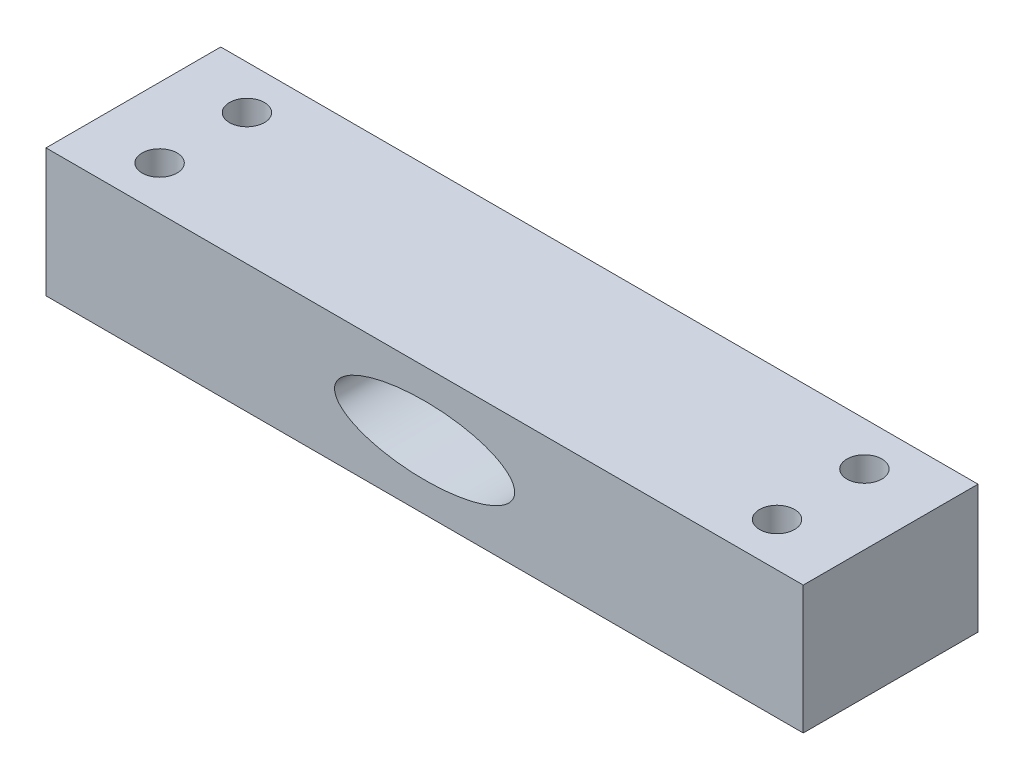
ISO-10303-21;
HEADER;
FILE_DESCRIPTION(('STEP AP214'),'2;1');
FILE_NAME('part.step','',(''),(''),'','','');
FILE_SCHEMA(('AUTOMOTIVE_DESIGN { 1 0 10303 214 1 1 1 1 }'));
ENDSEC;
DATA;
#1=APPLICATION_CONTEXT('core data for automotive mechanical design processes');
#2=APPLICATION_PROTOCOL_DEFINITION('international standard','automotive_design',2000,#1);
#3=PRODUCT_CONTEXT('',#1,'mechanical');
#4=PRODUCT('Part','Part','',(#3));
#5=PRODUCT_RELATED_PRODUCT_CATEGORY('part','',(#4));
#6=PRODUCT_DEFINITION_FORMATION('','',#4);
#7=PRODUCT_DEFINITION_CONTEXT('part definition',#1,'design');
#8=PRODUCT_DEFINITION('design','',#6,#7);
#9=PRODUCT_DEFINITION_SHAPE('','',#8);
#10=(LENGTH_UNIT() NAMED_UNIT(*) SI_UNIT(.MILLI.,.METRE.));
#11=(NAMED_UNIT(*) PLANE_ANGLE_UNIT() SI_UNIT($,.RADIAN.));
#12=(NAMED_UNIT(*) SI_UNIT($,.STERADIAN.) SOLID_ANGLE_UNIT());
#13=UNCERTAINTY_MEASURE_WITH_UNIT(LENGTH_MEASURE(1.E-05),#10,'distance_accuracy_value','');
#14=(GEOMETRIC_REPRESENTATION_CONTEXT(3) GLOBAL_UNCERTAINTY_ASSIGNED_CONTEXT((#13)) GLOBAL_UNIT_ASSIGNED_CONTEXT((#10,
#11,#12)) REPRESENTATION_CONTEXT('',''));
#15=CARTESIAN_POINT('',(0.,0.,0.));
#16=DIRECTION('',(0.,0.,1.));
#17=DIRECTION('',(1.,0.,0.));
#18=AXIS2_PLACEMENT_3D('',#15,#16,#17);
#19=CARTESIAN_POINT('',(65.,22.,15.));
#20=DIRECTION('',(-1.,0.,0.));
#21=DIRECTION('',(0.,0.,1.));
#22=AXIS2_PLACEMENT_3D('',#19,#20,#21);
#23=PLANE('',#22);
#24=DIRECTION('',(0.,0.,-1.));
#25=VECTOR('',#24,1.);
#26=CARTESIAN_POINT('',(65.,0.,15.));
#27=LINE('',#26,#25);
#28=CARTESIAN_POINT('',(65.,0.,15.));
#29=VERTEX_POINT('',#28);
#30=CARTESIAN_POINT('',(65.,0.,-15.));
#31=VERTEX_POINT('',#30);
#32=EDGE_CURVE('E178',#29,#31,#27,.T.);
#33=ORIENTED_EDGE('',*,*,#32,.T.);
#34=DIRECTION('',(0.,-1.,0.));
#35=VECTOR('',#34,1.);
#36=CARTESIAN_POINT('',(65.,22.,-15.));
#37=LINE('',#36,#35);
#38=CARTESIAN_POINT('',(65.,22.,-15.));
#39=VERTEX_POINT('',#38);
#40=EDGE_CURVE('E11',#39,#31,#37,.T.);
#41=ORIENTED_EDGE('',*,*,#40,.F.);
#42=DIRECTION('',(0.,0.,-1.));
#43=VECTOR('',#42,1.);
#44=CARTESIAN_POINT('',(65.,22.,15.));
#45=LINE('',#44,#43);
#46=CARTESIAN_POINT('',(65.,22.,15.));
#47=VERTEX_POINT('',#46);
#48=EDGE_CURVE('E226',#47,#39,#45,.T.);
#49=ORIENTED_EDGE('',*,*,#48,.F.);
#50=DIRECTION('',(0.,-1.,0.));
#51=VECTOR('',#50,1.);
#52=CARTESIAN_POINT('',(65.,22.,15.));
#53=LINE('',#52,#51);
#54=EDGE_CURVE('E230',#47,#29,#53,.T.);
#55=ORIENTED_EDGE('',*,*,#54,.T.);
#56=EDGE_LOOP('',(#33,#41,#49,#55));
#57=FACE_BOUND('',#56,.T.);
#58=ADVANCED_FACE('F38',(#57),#23,.F.);
#59=CARTESIAN_POINT('',(-65.,22.,-15.));
#60=DIRECTION('',(0.,0.,1.));
#61=DIRECTION('',(1.,0.,0.));
#62=AXIS2_PLACEMENT_3D('',#59,#60,#61);
#63=PLANE('',#62);
#64=CARTESIAN_POINT('',(0.,11.,-15.));
#65=DIRECTION('',(0.,0.,1.));
#66=DIRECTION('',(1.,0.,0.));
#67=AXIS2_PLACEMENT_3D('',#64,#65,#66);
#68=ELLIPSE('',#67,15.4617469757657,5.88469474450801);
#69=CARTESIAN_POINT('',(15.4617469757657,11.,-15.));
#70=VERTEX_POINT('',#69);
#71=EDGE_CURVE('E174',#70,#70,#68,.T.);
#72=ORIENTED_EDGE('',*,*,#71,.T.);
#73=EDGE_LOOP('',(#72));
#74=FACE_BOUND('',#73,.T.);
#75=DIRECTION('',(-1.,0.,0.));
#76=VECTOR('',#75,1.);
#77=CARTESIAN_POINT('',(-65.,0.,-15.));
#78=LINE('',#77,#76);
#79=CARTESIAN_POINT('',(-65.,0.,-15.));
#80=VERTEX_POINT('',#79);
#81=EDGE_CURVE('E211',#31,#80,#78,.T.);
#82=ORIENTED_EDGE('',*,*,#81,.T.);
#83=DIRECTION('',(0.,-1.,0.));
#84=VECTOR('',#83,1.);
#85=CARTESIAN_POINT('',(-65.,22.,-15.));
#86=LINE('',#85,#84);
#87=CARTESIAN_POINT('',(-65.,22.,-15.));
#88=VERTEX_POINT('',#87);
#89=EDGE_CURVE('E45',#88,#80,#86,.T.);
#90=ORIENTED_EDGE('',*,*,#89,.F.);
#91=DIRECTION('',(-1.,0.,0.));
#92=VECTOR('',#91,1.);
#93=CARTESIAN_POINT('',(-65.,22.,-15.));
#94=LINE('',#93,#92);
#95=EDGE_CURVE('E89',#39,#88,#94,.T.);
#96=ORIENTED_EDGE('',*,*,#95,.F.);
#97=ORIENTED_EDGE('',*,*,#40,.T.);
#98=EDGE_LOOP('',(#82,#90,#96,#97));
#99=FACE_BOUND('',#98,.T.);
#100=ADVANCED_FACE('F202',(#74,#99),#63,.F.);
#101=CARTESIAN_POINT('',(-65.,22.,15.));
#102=DIRECTION('',(1.,0.,0.));
#103=DIRECTION('',(0.,0.,-1.));
#104=AXIS2_PLACEMENT_3D('',#101,#102,#103);
#105=PLANE('',#104);
#106=DIRECTION('',(0.,0.,-1.));
#107=VECTOR('',#106,1.);
#108=CARTESIAN_POINT('',(-65.,17.3244994375708,-0.692463442069746));
#109=LINE('',#108,#107);
#110=CARTESIAN_POINT('',(-65.,17.3244994375708,0.692463442069746));
#111=VERTEX_POINT('',#110);
#112=CARTESIAN_POINT('',(-65.,17.3244994375708,-0.692463442069746));
#113=VERTEX_POINT('',#112);
#114=EDGE_CURVE('E140',#111,#113,#109,.T.);
#115=ORIENTED_EDGE('',*,*,#114,.F.);
#116=DIRECTION('',(0.,1.,0.));
#117=VECTOR('',#116,1.);
#118=CARTESIAN_POINT('',(-65.,2.12107986501732,0.692463442069746));
#119=LINE('',#118,#117);
#120=CARTESIAN_POINT('',(-65.,2.12107986501732,0.692463442069746));
#121=VERTEX_POINT('',#120);
#122=EDGE_CURVE('E52',#121,#111,#119,.T.);
#123=ORIENTED_EDGE('',*,*,#122,.F.);
#124=DIRECTION('',(0.,0.,1.));
#125=VECTOR('',#124,1.);
#126=CARTESIAN_POINT('',(-65.,2.12107986501732,-0.692463442069746));
#127=LINE('',#126,#125);
#128=CARTESIAN_POINT('',(-65.,2.12107986501732,-0.692463442069746));
#129=VERTEX_POINT('',#128);
#130=EDGE_CURVE('E131',#129,#121,#127,.T.);
#131=ORIENTED_EDGE('',*,*,#130,.F.);
#132=DIRECTION('',(0.,-1.,0.));
#133=VECTOR('',#132,1.);
#134=CARTESIAN_POINT('',(-65.,2.12107986501732,-0.692463442069746));
#135=LINE('',#134,#133);
#136=EDGE_CURVE('E134',#113,#129,#135,.T.);
#137=ORIENTED_EDGE('',*,*,#136,.F.);
#138=EDGE_LOOP('',(#115,#123,#131,#137));
#139=FACE_BOUND('',#138,.T.);
#140=DIRECTION('',(0.,0.,1.));
#141=VECTOR('',#140,1.);
#142=CARTESIAN_POINT('',(-65.,0.,15.));
#143=LINE('',#142,#141);
#144=CARTESIAN_POINT('',(-65.,0.,15.));
#145=VERTEX_POINT('',#144);
#146=EDGE_CURVE('E219',#80,#145,#143,.T.);
#147=ORIENTED_EDGE('',*,*,#146,.T.);
#148=DIRECTION('',(0.,-1.,0.));
#149=VECTOR('',#148,1.);
#150=CARTESIAN_POINT('',(-65.,22.,15.));
#151=LINE('',#150,#149);
#152=CARTESIAN_POINT('',(-65.,22.,15.));
#153=VERTEX_POINT('',#152);
#154=EDGE_CURVE('E224',#153,#145,#151,.T.);
#155=ORIENTED_EDGE('',*,*,#154,.F.);
#156=DIRECTION('',(0.,0.,1.));
#157=VECTOR('',#156,1.);
#158=CARTESIAN_POINT('',(-65.,22.,15.));
#159=LINE('',#158,#157);
#160=EDGE_CURVE('E223',#88,#153,#159,.T.);
#161=ORIENTED_EDGE('',*,*,#160,.F.);
#162=ORIENTED_EDGE('',*,*,#89,.T.);
#163=EDGE_LOOP('',(#147,#155,#161,#162));
#164=FACE_BOUND('',#163,.T.);
#165=ADVANCED_FACE('F199',(#139,#164),#105,.F.);
#166=CARTESIAN_POINT('',(-65.,22.,15.));
#167=DIRECTION('',(0.,0.,-1.));
#168=DIRECTION('',(-1.,0.,0.));
#169=AXIS2_PLACEMENT_3D('',#166,#167,#168);
#170=PLANE('',#169);
#171=CARTESIAN_POINT('',(0.,11.,15.));
#172=DIRECTION('',(0.,0.,1.));
#173=DIRECTION('',(1.,0.,0.));
#174=AXIS2_PLACEMENT_3D('',#171,#172,#173);
#175=ELLIPSE('',#174,15.4617469757657,5.88469474450801);
#176=CARTESIAN_POINT('',(15.4617469757657,11.,15.));
#177=VERTEX_POINT('',#176);
#178=EDGE_CURVE('E171',#177,#177,#175,.T.);
#179=ORIENTED_EDGE('',*,*,#178,.F.);
#180=EDGE_LOOP('',(#179));
#181=FACE_BOUND('',#180,.T.);
#182=DIRECTION('',(1.,0.,0.));
#183=VECTOR('',#182,1.);
#184=CARTESIAN_POINT('',(-65.,0.,15.));
#185=LINE('',#184,#183);
#186=EDGE_CURVE('E82',#145,#29,#185,.T.);
#187=ORIENTED_EDGE('',*,*,#186,.T.);
#188=ORIENTED_EDGE('',*,*,#54,.F.);
#189=DIRECTION('',(1.,0.,0.));
#190=VECTOR('',#189,1.);
#191=CARTESIAN_POINT('',(-65.,22.,15.));
#192=LINE('',#191,#190);
#193=EDGE_CURVE('E61',#153,#47,#192,.T.);
#194=ORIENTED_EDGE('',*,*,#193,.F.);
#195=ORIENTED_EDGE('',*,*,#154,.T.);
#196=EDGE_LOOP('',(#187,#188,#194,#195));
#197=FACE_BOUND('',#196,.T.);
#198=ADVANCED_FACE('F192',(#181,#197),#170,.F.);
#199=CARTESIAN_POINT('',(0.,22.,0.));
#200=DIRECTION('',(0.,-1.,0.));
#201=DIRECTION('',(0.,0.,-1.));
#202=AXIS2_PLACEMENT_3D('',#199,#200,#201);
#203=PLANE('',#202);
#204=CARTESIAN_POINT('',(-53.,22.,7.5));
#205=DIRECTION('',(0.,1.,0.));
#206=DIRECTION('',(0.,0.,-1.));
#207=AXIS2_PLACEMENT_3D('',#204,#205,#206);
#208=CIRCLE('',#207,3.);
#209=CARTESIAN_POINT('',(-53.,22.,4.5));
#210=VERTEX_POINT('',#209);
#211=EDGE_CURVE('E163',#210,#210,#208,.T.);
#212=ORIENTED_EDGE('',*,*,#211,.F.);
#213=EDGE_LOOP('',(#212));
#214=FACE_BOUND('',#213,.T.);
#215=CARTESIAN_POINT('',(53.,22.,7.50000000000044));
#216=DIRECTION('',(0.,1.,0.));
#217=DIRECTION('',(0.,0.,1.));
#218=AXIS2_PLACEMENT_3D('',#215,#216,#217);
#219=CIRCLE('',#218,3.);
#220=CARTESIAN_POINT('',(53.,22.,10.5000000000004));
#221=VERTEX_POINT('',#220);
#222=EDGE_CURVE('E157',#221,#221,#219,.T.);
#223=ORIENTED_EDGE('',*,*,#222,.F.);
#224=EDGE_LOOP('',(#223));
#225=FACE_BOUND('',#224,.T.);
#226=CARTESIAN_POINT('',(53.,22.,-7.50000000000044));
#227=DIRECTION('',(0.,1.,0.));
#228=DIRECTION('',(0.,0.,-1.));
#229=AXIS2_PLACEMENT_3D('',#226,#227,#228);
#230=CIRCLE('',#229,3.);
#231=CARTESIAN_POINT('',(53.,22.,-10.5000000000004));
#232=VERTEX_POINT('',#231);
#233=EDGE_CURVE('E150',#232,#232,#230,.T.);
#234=ORIENTED_EDGE('',*,*,#233,.F.);
#235=EDGE_LOOP('',(#234));
#236=FACE_BOUND('',#235,.T.);
#237=CARTESIAN_POINT('',(-53.,22.,-7.5));
#238=DIRECTION('',(0.,1.,0.));
#239=DIRECTION('',(0.,0.,1.));
#240=AXIS2_PLACEMENT_3D('',#237,#238,#239);
#241=CIRCLE('',#240,3.);
#242=CARTESIAN_POINT('',(-53.,22.,-4.5));
#243=VERTEX_POINT('',#242);
#244=EDGE_CURVE('E153',#243,#243,#241,.T.);
#245=ORIENTED_EDGE('',*,*,#244,.F.);
#246=EDGE_LOOP('',(#245));
#247=FACE_BOUND('',#246,.T.);
#248=ORIENTED_EDGE('',*,*,#48,.T.);
#249=ORIENTED_EDGE('',*,*,#95,.T.);
#250=ORIENTED_EDGE('',*,*,#160,.T.);
#251=ORIENTED_EDGE('',*,*,#193,.T.);
#252=EDGE_LOOP('',(#248,#249,#250,#251));
#253=FACE_BOUND('',#252,.T.);
#254=ADVANCED_FACE('F189',(#214,#225,#236,#247,#253),#203,.F.);
#255=CARTESIAN_POINT('',(0.,0.,0.));
#256=DIRECTION('',(0.,-1.,0.));
#257=DIRECTION('',(0.,0.,-1.));
#258=AXIS2_PLACEMENT_3D('',#255,#256,#257);
#259=PLANE('',#258);
#260=CARTESIAN_POINT('',(-53.,0.,7.5));
#261=DIRECTION('',(0.,1.,0.));
#262=DIRECTION('',(0.,0.,-1.));
#263=AXIS2_PLACEMENT_3D('',#260,#261,#262);
#264=CIRCLE('',#263,3.);
#265=CARTESIAN_POINT('',(-53.,0.,4.5));
#266=VERTEX_POINT('',#265);
#267=EDGE_CURVE('E146',#266,#266,#264,.T.);
#268=ORIENTED_EDGE('',*,*,#267,.T.);
#269=EDGE_LOOP('',(#268));
#270=FACE_BOUND('',#269,.T.);
#271=CARTESIAN_POINT('',(53.,0.,7.50000000000044));
#272=DIRECTION('',(0.,1.,0.));
#273=DIRECTION('',(0.,0.,1.));
#274=AXIS2_PLACEMENT_3D('',#271,#272,#273);
#275=CIRCLE('',#274,3.);
#276=CARTESIAN_POINT('',(53.,0.,10.5000000000004));
#277=VERTEX_POINT('',#276);
#278=EDGE_CURVE('E160',#277,#277,#275,.T.);
#279=ORIENTED_EDGE('',*,*,#278,.T.);
#280=EDGE_LOOP('',(#279));
#281=FACE_BOUND('',#280,.T.);
#282=CARTESIAN_POINT('',(53.,0.,-7.50000000000044));
#283=DIRECTION('',(0.,1.,0.));
#284=DIRECTION('',(0.,0.,-1.));
#285=AXIS2_PLACEMENT_3D('',#282,#283,#284);
#286=CIRCLE('',#285,3.);
#287=CARTESIAN_POINT('',(53.,0.,-10.5000000000004));
#288=VERTEX_POINT('',#287);
#289=EDGE_CURVE('E154',#288,#288,#286,.T.);
#290=ORIENTED_EDGE('',*,*,#289,.T.);
#291=EDGE_LOOP('',(#290));
#292=FACE_BOUND('',#291,.T.);
#293=CARTESIAN_POINT('',(-53.,0.,-7.5));
#294=DIRECTION('',(0.,1.,0.));
#295=DIRECTION('',(0.,0.,1.));
#296=AXIS2_PLACEMENT_3D('',#293,#294,#295);
#297=CIRCLE('',#296,3.);
#298=CARTESIAN_POINT('',(-53.,0.,-4.5));
#299=VERTEX_POINT('',#298);
#300=EDGE_CURVE('E168',#299,#299,#297,.T.);
#301=ORIENTED_EDGE('',*,*,#300,.T.);
#302=EDGE_LOOP('',(#301));
#303=FACE_BOUND('',#302,.T.);
#304=ORIENTED_EDGE('',*,*,#32,.F.);
#305=ORIENTED_EDGE('',*,*,#186,.F.);
#306=ORIENTED_EDGE('',*,*,#146,.F.);
#307=ORIENTED_EDGE('',*,*,#81,.F.);
#308=EDGE_LOOP('',(#304,#305,#306,#307));
#309=FACE_BOUND('',#308,.T.);
#310=ADVANCED_FACE('F186',(#270,#281,#292,#303,#309),#259,.T.);
#311=DIRECTION('',(0.,0.,1.));
#312=VECTOR('',#311,1.);
#313=SURFACE_OF_LINEAR_EXTRUSION('',#68,#312);
#314=ORIENTED_EDGE('',*,*,#71,.F.);
#315=EDGE_LOOP('',(#314));
#316=FACE_BOUND('',#315,.T.);
#317=ORIENTED_EDGE('',*,*,#178,.T.);
#318=EDGE_LOOP('',(#317));
#319=FACE_BOUND('',#318,.T.);
#320=ADVANCED_FACE('F181',(#316,#319),#313,.F.);
#321=CARTESIAN_POINT('',(-53.,0.,-7.5));
#322=DIRECTION('',(0.,1.,0.));
#323=DIRECTION('',(0.,0.,1.));
#324=AXIS2_PLACEMENT_3D('',#321,#322,#323);
#325=CYLINDRICAL_SURFACE('',#324,3.);
#326=ORIENTED_EDGE('',*,*,#300,.F.);
#327=EDGE_LOOP('',(#326));
#328=FACE_BOUND('',#327,.T.);
#329=ORIENTED_EDGE('',*,*,#244,.T.);
#330=EDGE_LOOP('',(#329));
#331=FACE_BOUND('',#330,.T.);
#332=ADVANCED_FACE('F185',(#328,#331),#325,.F.);
#333=CARTESIAN_POINT('',(53.,0.,-7.50000000000044));
#334=DIRECTION('',(0.,1.,0.));
#335=DIRECTION('',(0.,0.,1.));
#336=AXIS2_PLACEMENT_3D('',#333,#334,#335);
#337=CYLINDRICAL_SURFACE('',#336,3.);
#338=ORIENTED_EDGE('',*,*,#289,.F.);
#339=EDGE_LOOP('',(#338));
#340=FACE_BOUND('',#339,.T.);
#341=ORIENTED_EDGE('',*,*,#233,.T.);
#342=EDGE_LOOP('',(#341));
#343=FACE_BOUND('',#342,.T.);
#344=ADVANCED_FACE('F287',(#340,#343),#337,.F.);
#345=CARTESIAN_POINT('',(53.,0.,7.50000000000044));
#346=DIRECTION('',(0.,1.,0.));
#347=DIRECTION('',(0.,0.,1.));
#348=AXIS2_PLACEMENT_3D('',#345,#346,#347);
#349=CYLINDRICAL_SURFACE('',#348,3.);
#350=ORIENTED_EDGE('',*,*,#278,.F.);
#351=EDGE_LOOP('',(#350));
#352=FACE_BOUND('',#351,.T.);
#353=ORIENTED_EDGE('',*,*,#222,.T.);
#354=EDGE_LOOP('',(#353));
#355=FACE_BOUND('',#354,.T.);
#356=ADVANCED_FACE('F296',(#352,#355),#349,.F.);
#357=CARTESIAN_POINT('',(-53.,0.,7.5));
#358=DIRECTION('',(0.,1.,0.));
#359=DIRECTION('',(0.,0.,1.));
#360=AXIS2_PLACEMENT_3D('',#357,#358,#359);
#361=CYLINDRICAL_SURFACE('',#360,3.);
#362=ORIENTED_EDGE('',*,*,#267,.F.);
#363=EDGE_LOOP('',(#362));
#364=FACE_BOUND('',#363,.T.);
#365=ORIENTED_EDGE('',*,*,#211,.T.);
#366=EDGE_LOOP('',(#365));
#367=FACE_BOUND('',#366,.T.);
#368=ADVANCED_FACE('F306',(#364,#367),#361,.F.);
#369=CARTESIAN_POINT('',(-63.,2.12107986501732,0.692463442069746));
#370=DIRECTION('',(0.,0.,1.));
#371=DIRECTION('',(1.,0.,0.));
#372=AXIS2_PLACEMENT_3D('',#369,#370,#371);
#373=PLANE('',#372);
#374=ORIENTED_EDGE('',*,*,#122,.T.);
#375=DIRECTION('',(-1.,0.,0.));
#376=VECTOR('',#375,1.);
#377=CARTESIAN_POINT('',(-63.,17.3244994375708,0.692463442069746));
#378=LINE('',#377,#376);
#379=CARTESIAN_POINT('',(-63.,17.3244994375708,0.692463442069746));
#380=VERTEX_POINT('',#379);
#381=EDGE_CURVE('E109',#380,#111,#378,.T.);
#382=ORIENTED_EDGE('',*,*,#381,.F.);
#383=DIRECTION('',(0.,1.,0.));
#384=VECTOR('',#383,1.);
#385=CARTESIAN_POINT('',(-63.,2.12107986501732,0.692463442069746));
#386=LINE('',#385,#384);
#387=CARTESIAN_POINT('',(-63.,2.12107986501732,0.692463442069746));
#388=VERTEX_POINT('',#387);
#389=EDGE_CURVE('E113',#388,#380,#386,.T.);
#390=ORIENTED_EDGE('',*,*,#389,.F.);
#391=DIRECTION('',(-1.,0.,0.));
#392=VECTOR('',#391,1.);
#393=CARTESIAN_POINT('',(-63.,2.12107986501732,0.692463442069746));
#394=LINE('',#393,#392);
#395=EDGE_CURVE('E144',#388,#121,#394,.T.);
#396=ORIENTED_EDGE('',*,*,#395,.T.);
#397=EDGE_LOOP('',(#374,#382,#390,#396));
#398=FACE_BOUND('',#397,.T.);
#399=ADVANCED_FACE('F111',(#398),#373,.F.);
#400=CARTESIAN_POINT('',(-63.,2.12107986501732,-0.692463442069746));
#401=DIRECTION('',(0.,-1.,0.));
#402=DIRECTION('',(0.,0.,-1.));
#403=AXIS2_PLACEMENT_3D('',#400,#401,#402);
#404=PLANE('',#403);
#405=ORIENTED_EDGE('',*,*,#130,.T.);
#406=ORIENTED_EDGE('',*,*,#395,.F.);
#407=DIRECTION('',(0.,0.,1.));
#408=VECTOR('',#407,1.);
#409=CARTESIAN_POINT('',(-63.,2.12107986501732,-0.692463442069746));
#410=LINE('',#409,#408);
#411=CARTESIAN_POINT('',(-63.,2.12107986501732,-0.692463442069746));
#412=VERTEX_POINT('',#411);
#413=EDGE_CURVE('E119',#412,#388,#410,.T.);
#414=ORIENTED_EDGE('',*,*,#413,.F.);
#415=DIRECTION('',(-1.,0.,0.));
#416=VECTOR('',#415,1.);
#417=CARTESIAN_POINT('',(-63.,2.12107986501732,-0.692463442069746));
#418=LINE('',#417,#416);
#419=EDGE_CURVE('E147',#412,#129,#418,.T.);
#420=ORIENTED_EDGE('',*,*,#419,.T.);
#421=EDGE_LOOP('',(#405,#406,#414,#420));
#422=FACE_BOUND('',#421,.T.);
#423=ADVANCED_FACE('F322',(#422),#404,.F.);
#424=CARTESIAN_POINT('',(-63.,2.12107986501732,-0.692463442069746));
#425=DIRECTION('',(0.,0.,-1.));
#426=DIRECTION('',(-1.,0.,0.));
#427=AXIS2_PLACEMENT_3D('',#424,#425,#426);
#428=PLANE('',#427);
#429=ORIENTED_EDGE('',*,*,#136,.T.);
#430=ORIENTED_EDGE('',*,*,#419,.F.);
#431=DIRECTION('',(0.,-1.,0.));
#432=VECTOR('',#431,1.);
#433=CARTESIAN_POINT('',(-63.,2.12107986501732,-0.692463442069746));
#434=LINE('',#433,#432);
#435=CARTESIAN_POINT('',(-63.,17.3244994375708,-0.692463442069746));
#436=VERTEX_POINT('',#435);
#437=EDGE_CURVE('E127',#436,#412,#434,.T.);
#438=ORIENTED_EDGE('',*,*,#437,.F.);
#439=DIRECTION('',(-1.,0.,0.));
#440=VECTOR('',#439,1.);
#441=CARTESIAN_POINT('',(-63.,17.3244994375708,-0.692463442069746));
#442=LINE('',#441,#440);
#443=EDGE_CURVE('E118',#436,#113,#442,.T.);
#444=ORIENTED_EDGE('',*,*,#443,.T.);
#445=EDGE_LOOP('',(#429,#430,#438,#444));
#446=FACE_BOUND('',#445,.T.);
#447=ADVANCED_FACE('F331',(#446),#428,.F.);
#448=CARTESIAN_POINT('',(-63.,17.3244994375708,-0.692463442069746));
#449=DIRECTION('',(0.,1.,0.));
#450=DIRECTION('',(0.,0.,1.));
#451=AXIS2_PLACEMENT_3D('',#448,#449,#450);
#452=PLANE('',#451);
#453=ORIENTED_EDGE('',*,*,#114,.T.);
#454=ORIENTED_EDGE('',*,*,#443,.F.);
#455=DIRECTION('',(0.,0.,-1.));
#456=VECTOR('',#455,1.);
#457=CARTESIAN_POINT('',(-63.,17.3244994375708,-0.692463442069746));
#458=LINE('',#457,#456);
#459=EDGE_CURVE('E122',#380,#436,#458,.T.);
#460=ORIENTED_EDGE('',*,*,#459,.F.);
#461=ORIENTED_EDGE('',*,*,#381,.T.);
#462=EDGE_LOOP('',(#453,#454,#460,#461));
#463=FACE_BOUND('',#462,.T.);
#464=ADVANCED_FACE('F123',(#463),#452,.F.);
#465=CARTESIAN_POINT('',(-63.,0.,0.));
#466=DIRECTION('',(1.,0.,0.));
#467=DIRECTION('',(0.,0.,-1.));
#468=AXIS2_PLACEMENT_3D('',#465,#466,#467);
#469=PLANE('',#468);
#470=ORIENTED_EDGE('',*,*,#389,.T.);
#471=ORIENTED_EDGE('',*,*,#459,.T.);
#472=ORIENTED_EDGE('',*,*,#437,.T.);
#473=ORIENTED_EDGE('',*,*,#413,.T.);
#474=EDGE_LOOP('',(#470,#471,#472,#473));
#475=FACE_BOUND('',#474,.T.);
#476=ADVANCED_FACE('F129',(#475),#469,.F.);
#477=CLOSED_SHELL('',(#58,#100,#165,#198,#254,#310,#320,#332,#344,#356,#368,#399,#423,#447,#464,#476));
#478=MANIFOLD_SOLID_BREP('B2',#477);
#479=ADVANCED_BREP_SHAPE_REPRESENTATION('',(#18,#478),#14);
#480=SHAPE_DEFINITION_REPRESENTATION(#9,#479);
ENDSEC;
END-ISO-10303-21;
